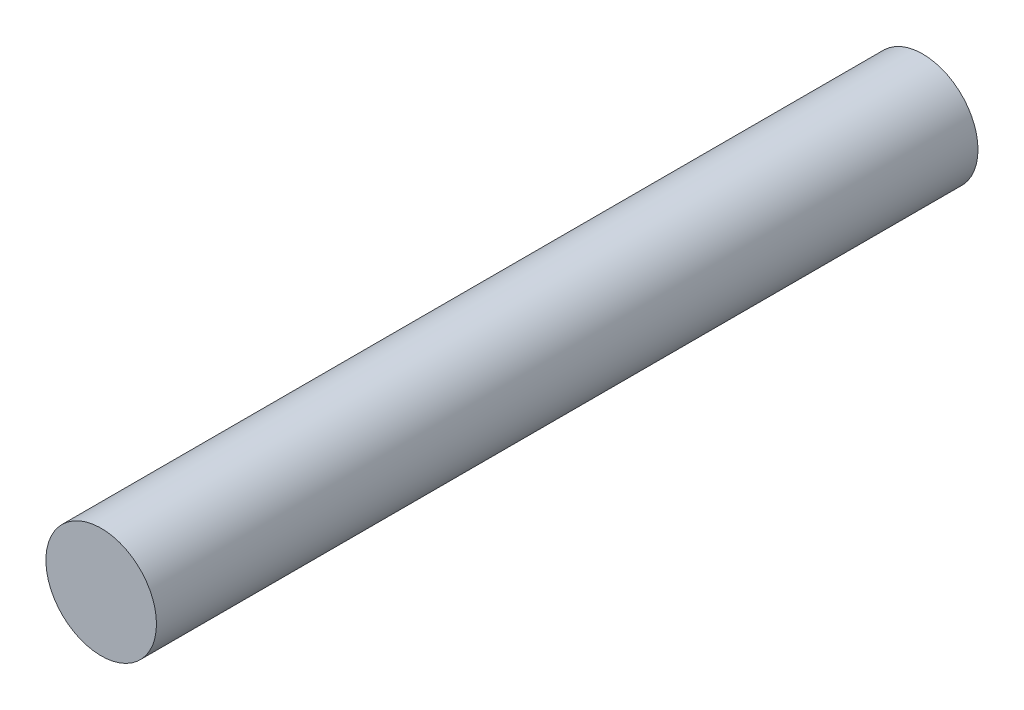
ISO-10303-21;
HEADER;
FILE_DESCRIPTION(('STEP AP214'),'2;1');
FILE_NAME('part.step','',(''),(''),'','','');
FILE_SCHEMA(('AUTOMOTIVE_DESIGN { 1 0 10303 214 1 1 1 1 }'));
ENDSEC;
DATA;
#1=APPLICATION_CONTEXT('core data for automotive mechanical design processes');
#2=APPLICATION_PROTOCOL_DEFINITION('international standard','automotive_design',2000,#1);
#3=PRODUCT_CONTEXT('',#1,'mechanical');
#4=PRODUCT('Part','Part','',(#3));
#5=PRODUCT_RELATED_PRODUCT_CATEGORY('part','',(#4));
#6=PRODUCT_DEFINITION_FORMATION('','',#4);
#7=PRODUCT_DEFINITION_CONTEXT('part definition',#1,'design');
#8=PRODUCT_DEFINITION('design','',#6,#7);
#9=PRODUCT_DEFINITION_SHAPE('','',#8);
#10=(LENGTH_UNIT() NAMED_UNIT(*) SI_UNIT(.MILLI.,.METRE.));
#11=(NAMED_UNIT(*) PLANE_ANGLE_UNIT() SI_UNIT($,.RADIAN.));
#12=(NAMED_UNIT(*) SI_UNIT($,.STERADIAN.) SOLID_ANGLE_UNIT());
#13=UNCERTAINTY_MEASURE_WITH_UNIT(LENGTH_MEASURE(1.E-05),#10,'distance_accuracy_value','');
#14=(GEOMETRIC_REPRESENTATION_CONTEXT(3) GLOBAL_UNCERTAINTY_ASSIGNED_CONTEXT((#13)) GLOBAL_UNIT_ASSIGNED_CONTEXT((#10,
#11,#12)) REPRESENTATION_CONTEXT('',''));
#15=CARTESIAN_POINT('',(0.,0.,0.));
#16=DIRECTION('',(0.,0.,1.));
#17=DIRECTION('',(1.,0.,0.));
#18=AXIS2_PLACEMENT_3D('',#15,#16,#17);
#19=CARTESIAN_POINT('',(0.,0.,135.89));
#20=DIRECTION('',(0.,0.,-1.));
#21=DIRECTION('',(-1.,0.,0.));
#22=AXIS2_PLACEMENT_3D('',#19,#20,#21);
#23=CYLINDRICAL_SURFACE('',#22,9.144);
#24=CARTESIAN_POINT('',(0.,0.,135.89));
#25=DIRECTION('',(0.,0.,1.));
#26=DIRECTION('',(1.,0.,0.));
#27=AXIS2_PLACEMENT_3D('',#24,#25,#26);
#28=CIRCLE('',#27,9.144);
#29=CARTESIAN_POINT('',(9.144,0.,135.89));
#30=VERTEX_POINT('',#29);
#31=EDGE_CURVE('E10',#30,#30,#28,.T.);
#32=ORIENTED_EDGE('',*,*,#31,.F.);
#33=EDGE_LOOP('',(#32));
#34=FACE_BOUND('',#33,.T.);
#35=CARTESIAN_POINT('',(0.,0.,0.));
#36=DIRECTION('',(0.,0.,1.));
#37=DIRECTION('',(1.,0.,0.));
#38=AXIS2_PLACEMENT_3D('',#35,#36,#37);
#39=CIRCLE('',#38,9.144);
#40=CARTESIAN_POINT('',(9.144,0.,0.));
#41=VERTEX_POINT('',#40);
#42=EDGE_CURVE('E34',#41,#41,#39,.T.);
#43=ORIENTED_EDGE('',*,*,#42,.T.);
#44=EDGE_LOOP('',(#43));
#45=FACE_BOUND('',#44,.T.);
#46=ADVANCED_FACE('F31',(#34,#45),#23,.T.);
#47=CARTESIAN_POINT('',(0.,0.,135.89));
#48=DIRECTION('',(0.,0.,1.));
#49=DIRECTION('',(1.,0.,0.));
#50=AXIS2_PLACEMENT_3D('',#47,#48,#49);
#51=PLANE('',#50);
#52=ORIENTED_EDGE('',*,*,#31,.T.);
#53=EDGE_LOOP('',(#52));
#54=FACE_BOUND('',#53,.T.);
#55=ADVANCED_FACE('F46',(#54),#51,.T.);
#56=CARTESIAN_POINT('',(0.,0.,0.));
#57=DIRECTION('',(0.,0.,1.));
#58=DIRECTION('',(1.,0.,0.));
#59=AXIS2_PLACEMENT_3D('',#56,#57,#58);
#60=PLANE('',#59);
#61=ORIENTED_EDGE('',*,*,#42,.F.);
#62=EDGE_LOOP('',(#61));
#63=FACE_BOUND('',#62,.T.);
#64=ADVANCED_FACE('F44',(#63),#60,.F.);
#65=CLOSED_SHELL('',(#46,#55,#64));
#66=MANIFOLD_SOLID_BREP('B2',#65);
#67=ADVANCED_BREP_SHAPE_REPRESENTATION('',(#18,#66),#14);
#68=SHAPE_DEFINITION_REPRESENTATION(#9,#67);
ENDSEC;
END-ISO-10303-21;
